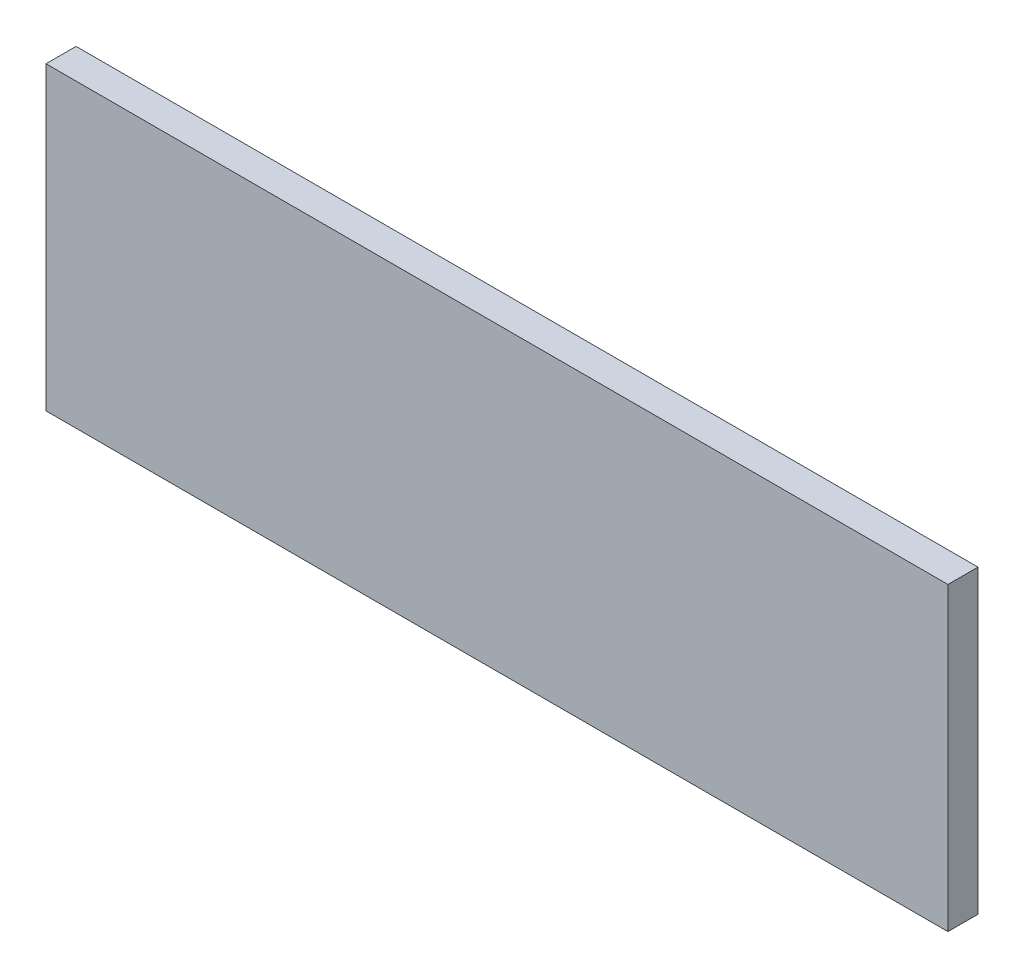
ISO-10303-21;
HEADER;
FILE_DESCRIPTION(('STEP AP214'),'2;1');
FILE_NAME('part.step','',(''),(''),'','','');
FILE_SCHEMA(('AUTOMOTIVE_DESIGN { 1 0 10303 214 1 1 1 1 }'));
ENDSEC;
DATA;
#1=APPLICATION_CONTEXT('core data for automotive mechanical design processes');
#2=APPLICATION_PROTOCOL_DEFINITION('international standard','automotive_design',2000,#1);
#3=PRODUCT_CONTEXT('',#1,'mechanical');
#4=PRODUCT('Part','Part','',(#3));
#5=PRODUCT_RELATED_PRODUCT_CATEGORY('part','',(#4));
#6=PRODUCT_DEFINITION_FORMATION('','',#4);
#7=PRODUCT_DEFINITION_CONTEXT('part definition',#1,'design');
#8=PRODUCT_DEFINITION('design','',#6,#7);
#9=PRODUCT_DEFINITION_SHAPE('','',#8);
#10=(LENGTH_UNIT() NAMED_UNIT(*) SI_UNIT(.MILLI.,.METRE.));
#11=(NAMED_UNIT(*) PLANE_ANGLE_UNIT() SI_UNIT($,.RADIAN.));
#12=(NAMED_UNIT(*) SI_UNIT($,.STERADIAN.) SOLID_ANGLE_UNIT());
#13=UNCERTAINTY_MEASURE_WITH_UNIT(LENGTH_MEASURE(1.E-05),#10,'distance_accuracy_value','');
#14=(GEOMETRIC_REPRESENTATION_CONTEXT(3) GLOBAL_UNCERTAINTY_ASSIGNED_CONTEXT((#13)) GLOBAL_UNIT_ASSIGNED_CONTEXT((#10,
#11,#12)) REPRESENTATION_CONTEXT('',''));
#15=CARTESIAN_POINT('',(0.,0.,0.));
#16=DIRECTION('',(0.,0.,1.));
#17=DIRECTION('',(1.,0.,0.));
#18=AXIS2_PLACEMENT_3D('',#15,#16,#17);
#19=CARTESIAN_POINT('',(0.,0.,100.));
#20=DIRECTION('',(1.,0.,0.));
#21=DIRECTION('',(0.,0.,-1.));
#22=AXIS2_PLACEMENT_3D('',#19,#20,#21);
#23=PLANE('',#22);
#24=DIRECTION('',(0.,-1.,0.));
#25=VECTOR('',#24,1.);
#26=CARTESIAN_POINT('',(0.,0.,0.));
#27=LINE('',#26,#25);
#28=CARTESIAN_POINT('',(0.,0.,0.));
#29=VERTEX_POINT('',#28);
#30=CARTESIAN_POINT('',(0.,-1000.,0.));
#31=VERTEX_POINT('',#30);
#32=EDGE_CURVE('E96',#29,#31,#27,.T.);
#33=ORIENTED_EDGE('',*,*,#32,.T.);
#34=DIRECTION('',(0.,0.,-1.));
#35=VECTOR('',#34,1.);
#36=CARTESIAN_POINT('',(0.,-1000.,100.));
#37=LINE('',#36,#35);
#38=CARTESIAN_POINT('',(0.,-1000.,100.));
#39=VERTEX_POINT('',#38);
#40=EDGE_CURVE('E11',#39,#31,#37,.T.);
#41=ORIENTED_EDGE('',*,*,#40,.F.);
#42=DIRECTION('',(0.,-1.,0.));
#43=VECTOR('',#42,1.);
#44=CARTESIAN_POINT('',(0.,0.,100.));
#45=LINE('',#44,#43);
#46=CARTESIAN_POINT('',(0.,0.,100.));
#47=VERTEX_POINT('',#46);
#48=EDGE_CURVE('E84',#47,#39,#45,.T.);
#49=ORIENTED_EDGE('',*,*,#48,.F.);
#50=DIRECTION('',(0.,0.,-1.));
#51=VECTOR('',#50,1.);
#52=CARTESIAN_POINT('',(0.,0.,100.));
#53=LINE('',#52,#51);
#54=EDGE_CURVE('E92',#47,#29,#53,.T.);
#55=ORIENTED_EDGE('',*,*,#54,.T.);
#56=EDGE_LOOP('',(#33,#41,#49,#55));
#57=FACE_BOUND('',#56,.T.);
#58=ADVANCED_FACE('F33',(#57),#23,.F.);
#59=CARTESIAN_POINT('',(0.,-1000.,100.));
#60=DIRECTION('',(0.,1.,0.));
#61=DIRECTION('',(0.,0.,1.));
#62=AXIS2_PLACEMENT_3D('',#59,#60,#61);
#63=PLANE('',#62);
#64=DIRECTION('',(1.,0.,0.));
#65=VECTOR('',#64,1.);
#66=CARTESIAN_POINT('',(0.,-1000.,0.));
#67=LINE('',#66,#65);
#68=CARTESIAN_POINT('',(3000.,-1000.,0.));
#69=VERTEX_POINT('',#68);
#70=EDGE_CURVE('E88',#31,#69,#67,.T.);
#71=ORIENTED_EDGE('',*,*,#70,.T.);
#72=DIRECTION('',(0.,0.,-1.));
#73=VECTOR('',#72,1.);
#74=CARTESIAN_POINT('',(3000.,-1000.,100.));
#75=LINE('',#74,#73);
#76=CARTESIAN_POINT('',(3000.,-1000.,100.));
#77=VERTEX_POINT('',#76);
#78=EDGE_CURVE('E41',#77,#69,#75,.T.);
#79=ORIENTED_EDGE('',*,*,#78,.F.);
#80=DIRECTION('',(1.,0.,0.));
#81=VECTOR('',#80,1.);
#82=CARTESIAN_POINT('',(0.,-1000.,100.));
#83=LINE('',#82,#81);
#84=EDGE_CURVE('E79',#39,#77,#83,.T.);
#85=ORIENTED_EDGE('',*,*,#84,.F.);
#86=ORIENTED_EDGE('',*,*,#40,.T.);
#87=EDGE_LOOP('',(#71,#79,#85,#86));
#88=FACE_BOUND('',#87,.T.);
#89=ADVANCED_FACE('F87',(#88),#63,.F.);
#90=CARTESIAN_POINT('',(3000.,0.,100.));
#91=DIRECTION('',(-1.,0.,0.));
#92=DIRECTION('',(0.,0.,1.));
#93=AXIS2_PLACEMENT_3D('',#90,#91,#92);
#94=PLANE('',#93);
#95=DIRECTION('',(0.,1.,0.));
#96=VECTOR('',#95,1.);
#97=CARTESIAN_POINT('',(3000.,0.,0.));
#98=LINE('',#97,#96);
#99=CARTESIAN_POINT('',(3000.,0.,0.));
#100=VERTEX_POINT('',#99);
#101=EDGE_CURVE('E66',#69,#100,#98,.T.);
#102=ORIENTED_EDGE('',*,*,#101,.T.);
#103=DIRECTION('',(0.,0.,-1.));
#104=VECTOR('',#103,1.);
#105=CARTESIAN_POINT('',(3000.,0.,100.));
#106=LINE('',#105,#104);
#107=CARTESIAN_POINT('',(3000.,0.,100.));
#108=VERTEX_POINT('',#107);
#109=EDGE_CURVE('E89',#108,#100,#106,.T.);
#110=ORIENTED_EDGE('',*,*,#109,.F.);
#111=DIRECTION('',(0.,1.,0.));
#112=VECTOR('',#111,1.);
#113=CARTESIAN_POINT('',(3000.,0.,100.));
#114=LINE('',#113,#112);
#115=EDGE_CURVE('E82',#77,#108,#114,.T.);
#116=ORIENTED_EDGE('',*,*,#115,.F.);
#117=ORIENTED_EDGE('',*,*,#78,.T.);
#118=EDGE_LOOP('',(#102,#110,#116,#117));
#119=FACE_BOUND('',#118,.T.);
#120=ADVANCED_FACE('F90',(#119),#94,.F.);
#121=CARTESIAN_POINT('',(0.,0.,100.));
#122=DIRECTION('',(0.,-1.,0.));
#123=DIRECTION('',(0.,0.,-1.));
#124=AXIS2_PLACEMENT_3D('',#121,#122,#123);
#125=PLANE('',#124);
#126=DIRECTION('',(-1.,0.,0.));
#127=VECTOR('',#126,1.);
#128=CARTESIAN_POINT('',(0.,0.,0.));
#129=LINE('',#128,#127);
#130=EDGE_CURVE('E72',#100,#29,#129,.T.);
#131=ORIENTED_EDGE('',*,*,#130,.T.);
#132=ORIENTED_EDGE('',*,*,#54,.F.);
#133=DIRECTION('',(-1.,0.,0.));
#134=VECTOR('',#133,1.);
#135=CARTESIAN_POINT('',(0.,0.,100.));
#136=LINE('',#135,#134);
#137=EDGE_CURVE('E49',#108,#47,#136,.T.);
#138=ORIENTED_EDGE('',*,*,#137,.F.);
#139=ORIENTED_EDGE('',*,*,#109,.T.);
#140=EDGE_LOOP('',(#131,#132,#138,#139));
#141=FACE_BOUND('',#140,.T.);
#142=ADVANCED_FACE('F103',(#141),#125,.F.);
#143=CARTESIAN_POINT('',(0.,0.,100.));
#144=DIRECTION('',(0.,0.,1.));
#145=DIRECTION('',(1.,0.,0.));
#146=AXIS2_PLACEMENT_3D('',#143,#144,#145);
#147=PLANE('',#146);
#148=ORIENTED_EDGE('',*,*,#48,.T.);
#149=ORIENTED_EDGE('',*,*,#84,.T.);
#150=ORIENTED_EDGE('',*,*,#115,.T.);
#151=ORIENTED_EDGE('',*,*,#137,.T.);
#152=EDGE_LOOP('',(#148,#149,#150,#151));
#153=FACE_BOUND('',#152,.T.);
#154=ADVANCED_FACE('F80',(#153),#147,.T.);
#155=CARTESIAN_POINT('',(0.,0.,0.));
#156=DIRECTION('',(0.,0.,1.));
#157=DIRECTION('',(1.,0.,0.));
#158=AXIS2_PLACEMENT_3D('',#155,#156,#157);
#159=PLANE('',#158);
#160=ORIENTED_EDGE('',*,*,#32,.F.);
#161=ORIENTED_EDGE('',*,*,#130,.F.);
#162=ORIENTED_EDGE('',*,*,#101,.F.);
#163=ORIENTED_EDGE('',*,*,#70,.F.);
#164=EDGE_LOOP('',(#160,#161,#162,#163));
#165=FACE_BOUND('',#164,.T.);
#166=ADVANCED_FACE('F106',(#165),#159,.F.);
#167=CLOSED_SHELL('',(#58,#89,#120,#142,#154,#166));
#168=MANIFOLD_SOLID_BREP('B2',#167);
#169=ADVANCED_BREP_SHAPE_REPRESENTATION('',(#18,#168),#14);
#170=SHAPE_DEFINITION_REPRESENTATION(#9,#169);
ENDSEC;
END-ISO-10303-21;
